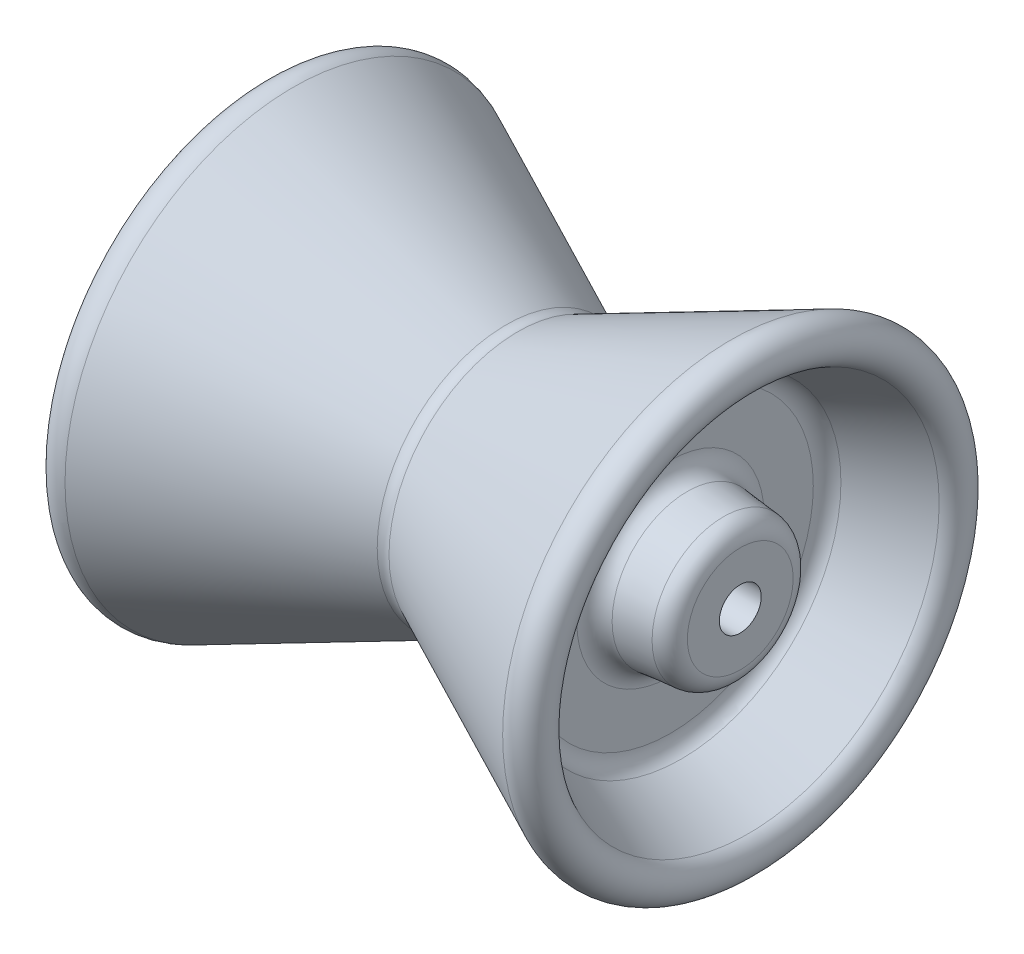
ISO-10303-21;
HEADER;
FILE_DESCRIPTION(('STEP AP214'),'2;1');
FILE_NAME('part.step','',(''),(''),'','','');
FILE_SCHEMA(('AUTOMOTIVE_DESIGN { 1 0 10303 214 1 1 1 1 }'));
ENDSEC;
DATA;
#1=APPLICATION_CONTEXT('core data for automotive mechanical design processes');
#2=APPLICATION_PROTOCOL_DEFINITION('international standard','automotive_design',2000,#1);
#3=PRODUCT_CONTEXT('',#1,'mechanical');
#4=PRODUCT('Part','Part','',(#3));
#5=PRODUCT_RELATED_PRODUCT_CATEGORY('part','',(#4));
#6=PRODUCT_DEFINITION_FORMATION('','',#4);
#7=PRODUCT_DEFINITION_CONTEXT('part definition',#1,'design');
#8=PRODUCT_DEFINITION('design','',#6,#7);
#9=PRODUCT_DEFINITION_SHAPE('','',#8);
#10=(LENGTH_UNIT() NAMED_UNIT(*) SI_UNIT(.MILLI.,.METRE.));
#11=(NAMED_UNIT(*) PLANE_ANGLE_UNIT() SI_UNIT($,.RADIAN.));
#12=(NAMED_UNIT(*) SI_UNIT($,.STERADIAN.) SOLID_ANGLE_UNIT());
#13=UNCERTAINTY_MEASURE_WITH_UNIT(LENGTH_MEASURE(1.E-05),#10,'distance_accuracy_value','');
#14=(GEOMETRIC_REPRESENTATION_CONTEXT(3) GLOBAL_UNCERTAINTY_ASSIGNED_CONTEXT((#13)) GLOBAL_UNIT_ASSIGNED_CONTEXT((#10,
#11,#12)) REPRESENTATION_CONTEXT('',''));
#15=CARTESIAN_POINT('',(0.,0.,0.));
#16=DIRECTION('',(0.,0.,1.));
#17=DIRECTION('',(1.,0.,0.));
#18=AXIS2_PLACEMENT_3D('',#15,#16,#17);
#19=CARTESIAN_POINT('',(253.421908313858,0.,-272.72374160698));
#20=DIRECTION('',(1.,0.,0.));
#21=DIRECTION('',(0.,0.,-1.));
#22=AXIS2_PLACEMENT_3D('',#19,#20,#21);
#23=CONICAL_SURFACE('',#22,204.98980954431,0.436332312998627);
#24=CARTESIAN_POINT('',(181.547634765186,0.,-272.72374160698));
#25=DIRECTION('',(-1.,0.,0.));
#26=DIRECTION('',(0.,0.,1.));
#27=AXIS2_PLACEMENT_3D('',#24,#25,#26);
#28=CIRCLE('',#27,171.474285364233);
#29=CARTESIAN_POINT('',(181.547634765186,0.,-101.249456242747));
#30=VERTEX_POINT('',#29);
#31=EDGE_CURVE('E123',#30,#30,#28,.T.);
#32=ORIENTED_EDGE('',*,*,#31,.T.);
#33=EDGE_LOOP('',(#32));
#34=FACE_BOUND('',#33,.T.);
#35=CARTESIAN_POINT('',(253.421908313858,0.,-272.72374160698));
#36=DIRECTION('',(-1.,0.,0.));
#37=DIRECTION('',(0.,0.,1.));
#38=AXIS2_PLACEMENT_3D('',#35,#36,#37);
#39=CIRCLE('',#38,204.98980954431);
#40=CARTESIAN_POINT('',(253.421908313858,0.,-67.7339320626702));
#41=VERTEX_POINT('',#40);
#42=EDGE_CURVE('E10',#41,#41,#39,.T.);
#43=ORIENTED_EDGE('',*,*,#42,.F.);
#44=EDGE_LOOP('',(#43));
#45=FACE_BOUND('',#44,.T.);
#46=ADVANCED_FACE('F35',(#34,#45),#23,.F.);
#47=CARTESIAN_POINT('',(244.124306555561,0.,-272.72374160698));
#48=DIRECTION('',(-1.,0.,0.));
#49=DIRECTION('',(0.,0.,1.));
#50=AXIS2_PLACEMENT_3D('',#47,#48,#49);
#51=TOROIDAL_SURFACE('',#50,224.928580859111,21.9999999999957);
#52=CARTESIAN_POINT('',(234.826704797267,0.,-272.72374160698));
#53=DIRECTION('',(-1.,0.,0.));
#54=DIRECTION('',(0.,0.,1.));
#55=AXIS2_PLACEMENT_3D('',#52,#53,#54);
#56=CIRCLE('',#55,244.867352173913);
#57=CARTESIAN_POINT('',(234.826704797267,0.,-27.8563894330671));
#58=VERTEX_POINT('',#57);
#59=EDGE_CURVE('E41',#58,#58,#56,.T.);
#60=ORIENTED_EDGE('',*,*,#59,.F.);
#61=EDGE_LOOP('',(#60));
#62=FACE_BOUND('',#61,.T.);
#63=ORIENTED_EDGE('',*,*,#42,.T.);
#64=EDGE_LOOP('',(#63));
#65=FACE_BOUND('',#64,.T.);
#66=ADVANCED_FACE('F337',(#62,#65),#51,.T.);
#67=CARTESIAN_POINT('',(234.826704797267,0.,-272.72374160698));
#68=DIRECTION('',(1.,0.,0.));
#69=DIRECTION('',(0.,0.,-1.));
#70=AXIS2_PLACEMENT_3D('',#67,#68,#69);
#71=CONICAL_SURFACE('',#70,244.867352173913,0.436332312998575);
#72=CARTESIAN_POINT('',(6.33927392611031,0.,-272.72374160698));
#73=DIRECTION('',(-1.,0.,0.));
#74=DIRECTION('',(0.,0.,1.));
#75=AXIS2_PLACEMENT_3D('',#72,#73,#74);
#76=CIRCLE('',#75,138.321913366534);
#77=CARTESIAN_POINT('',(6.33927392611031,0.,-134.401828240446));
#78=VERTEX_POINT('',#77);
#79=EDGE_CURVE('E45',#78,#78,#76,.T.);
#80=ORIENTED_EDGE('',*,*,#79,.F.);
#81=EDGE_LOOP('',(#80));
#82=FACE_BOUND('',#81,.T.);
#83=ORIENTED_EDGE('',*,*,#59,.T.);
#84=EDGE_LOOP('',(#83));
#85=FACE_BOUND('',#84,.T.);
#86=ADVANCED_FACE('F334',(#82,#85),#71,.T.);
#87=CARTESIAN_POINT('',(0.,0.,-272.72374160698));
#88=DIRECTION('',(-1.,0.,0.));
#89=DIRECTION('',(0.,0.,1.));
#90=AXIS2_PLACEMENT_3D('',#87,#88,#89);
#91=TOROIDAL_SURFACE('',#90,151.916530172083,14.9999999999996);
#92=ORIENTED_EDGE('',*,*,#79,.T.);
#93=EDGE_LOOP('',(#92));
#94=FACE_BOUND('',#93,.T.);
#95=CARTESIAN_POINT('',(-6.33927392611031,0.,-272.72374160698));
#96=DIRECTION('',(-1.,0.,0.));
#97=DIRECTION('',(0.,0.,1.));
#98=AXIS2_PLACEMENT_3D('',#95,#96,#97);
#99=CIRCLE('',#98,138.321913366534);
#100=CARTESIAN_POINT('',(-6.33927392611031,0.,-134.401828240446));
#101=VERTEX_POINT('',#100);
#102=EDGE_CURVE('E49',#101,#101,#99,.T.);
#103=ORIENTED_EDGE('',*,*,#102,.F.);
#104=EDGE_LOOP('',(#103));
#105=FACE_BOUND('',#104,.T.);
#106=ADVANCED_FACE('F330',(#94,#105),#91,.F.);
#107=CARTESIAN_POINT('',(-234.826704797267,0.,-272.72374160698));
#108=DIRECTION('',(-1.,0.,0.));
#109=DIRECTION('',(0.,0.,1.));
#110=AXIS2_PLACEMENT_3D('',#107,#108,#109);
#111=CONICAL_SURFACE('',#110,244.867352173916,0.436332312998585);
#112=ORIENTED_EDGE('',*,*,#102,.T.);
#113=EDGE_LOOP('',(#112));
#114=FACE_BOUND('',#113,.T.);
#115=CARTESIAN_POINT('',(-234.826704797267,0.,-272.72374160698));
#116=DIRECTION('',(-1.,0.,0.));
#117=DIRECTION('',(0.,0.,1.));
#118=AXIS2_PLACEMENT_3D('',#115,#116,#117);
#119=CIRCLE('',#118,244.867352173916);
#120=CARTESIAN_POINT('',(-234.826704797267,0.,-27.8563894330646));
#121=VERTEX_POINT('',#120);
#122=EDGE_CURVE('E54',#121,#121,#119,.T.);
#123=ORIENTED_EDGE('',*,*,#122,.F.);
#124=EDGE_LOOP('',(#123));
#125=FACE_BOUND('',#124,.T.);
#126=ADVANCED_FACE('F326',(#114,#125),#111,.T.);
#127=CARTESIAN_POINT('',(-244.124306555561,0.,-272.72374160698));
#128=DIRECTION('',(-1.,0.,0.));
#129=DIRECTION('',(0.,0.,1.));
#130=AXIS2_PLACEMENT_3D('',#127,#128,#129);
#131=TOROIDAL_SURFACE('',#130,224.928580859111,21.9999999999981);
#132=ORIENTED_EDGE('',*,*,#122,.T.);
#133=EDGE_LOOP('',(#132));
#134=FACE_BOUND('',#133,.T.);
#135=CARTESIAN_POINT('',(-253.421908313856,0.,-272.72374160698));
#136=DIRECTION('',(-1.,0.,0.));
#137=DIRECTION('',(0.,0.,1.));
#138=AXIS2_PLACEMENT_3D('',#135,#136,#137);
#139=CIRCLE('',#138,204.989809544305);
#140=CARTESIAN_POINT('',(-253.421908313856,0.,-67.7339320626748));
#141=VERTEX_POINT('',#140);
#142=EDGE_CURVE('E57',#141,#141,#139,.T.);
#143=ORIENTED_EDGE('',*,*,#142,.F.);
#144=EDGE_LOOP('',(#143));
#145=FACE_BOUND('',#144,.T.);
#146=ADVANCED_FACE('F322',(#134,#145),#131,.T.);
#147=CARTESIAN_POINT('',(-253.421908313856,0.,-272.72374160698));
#148=DIRECTION('',(-1.,0.,0.));
#149=DIRECTION('',(0.,0.,1.));
#150=AXIS2_PLACEMENT_3D('',#147,#148,#149);
#151=CONICAL_SURFACE('',#150,204.989809544305,0.436332312998582);
#152=CARTESIAN_POINT('',(-181.547634765186,0.,-272.72374160698));
#153=DIRECTION('',(-1.,0.,0.));
#154=DIRECTION('',(0.,0.,1.));
#155=AXIS2_PLACEMENT_3D('',#152,#153,#154);
#156=CIRCLE('',#155,171.474285364233);
#157=CARTESIAN_POINT('',(-181.547634765186,0.,-101.249456242747));
#158=VERTEX_POINT('',#157);
#159=EDGE_CURVE('E60',#158,#158,#156,.T.);
#160=ORIENTED_EDGE('',*,*,#159,.F.);
#161=EDGE_LOOP('',(#160));
#162=FACE_BOUND('',#161,.T.);
#163=ORIENTED_EDGE('',*,*,#142,.T.);
#164=EDGE_LOOP('',(#163));
#165=FACE_BOUND('',#164,.T.);
#166=ADVANCED_FACE('F318',(#162,#165),#151,.F.);
#167=CARTESIAN_POINT('',(-190.,0.,-272.72374160698));
#168=DIRECTION('',(-1.,0.,0.));
#169=DIRECTION('',(0.,0.,1.));
#170=AXIS2_PLACEMENT_3D('',#167,#168,#169);
#171=TOROIDAL_SURFACE('',#170,153.3481296235,20.);
#172=ORIENTED_EDGE('',*,*,#159,.T.);
#173=EDGE_LOOP('',(#172));
#174=FACE_BOUND('',#173,.T.);
#175=CARTESIAN_POINT('',(-170.,0.,-272.72374160698));
#176=DIRECTION('',(-1.,0.,0.));
#177=DIRECTION('',(0.,0.,1.));
#178=AXIS2_PLACEMENT_3D('',#175,#176,#177);
#179=CIRCLE('',#178,153.3481296235);
#180=CARTESIAN_POINT('',(-170.,0.,-119.37561198348));
#181=VERTEX_POINT('',#180);
#182=EDGE_CURVE('E63',#181,#181,#179,.T.);
#183=ORIENTED_EDGE('',*,*,#182,.F.);
#184=EDGE_LOOP('',(#183));
#185=FACE_BOUND('',#184,.T.);
#186=ADVANCED_FACE('F314',(#174,#185),#171,.F.);
#187=CARTESIAN_POINT('',(-170.,0.,0.));
#188=DIRECTION('',(1.,0.,0.));
#189=DIRECTION('',(0.,0.,-1.));
#190=AXIS2_PLACEMENT_3D('',#187,#188,#189);
#191=PLANE('',#190);
#192=CARTESIAN_POINT('',(-170.,0.,-272.72374160698));
#193=DIRECTION('',(-1.,0.,0.));
#194=DIRECTION('',(0.,0.,1.));
#195=AXIS2_PLACEMENT_3D('',#192,#193,#194);
#196=CIRCLE('',#195,100.453690595235);
#197=CARTESIAN_POINT('',(-170.,0.,-172.270051011745));
#198=VERTEX_POINT('',#197);
#199=EDGE_CURVE('E66',#198,#198,#196,.T.);
#200=ORIENTED_EDGE('',*,*,#199,.F.);
#201=EDGE_LOOP('',(#200));
#202=FACE_BOUND('',#201,.T.);
#203=ORIENTED_EDGE('',*,*,#182,.T.);
#204=EDGE_LOOP('',(#203));
#205=FACE_BOUND('',#204,.T.);
#206=ADVANCED_FACE('F310',(#202,#205),#191,.F.);
#207=CARTESIAN_POINT('',(-190.,0.,-272.72374160698));
#208=DIRECTION('',(-1.,0.,0.));
#209=DIRECTION('',(0.,0.,1.));
#210=AXIS2_PLACEMENT_3D('',#207,#208,#209);
#211=TOROIDAL_SURFACE('',#210,100.453690595235,20.);
#212=ORIENTED_EDGE('',*,*,#199,.T.);
#213=EDGE_LOOP('',(#212));
#214=FACE_BOUND('',#213,.T.);
#215=CARTESIAN_POINT('',(-188.00992561958,0.,-272.72374160698));
#216=DIRECTION('',(-1.,0.,0.));
#217=DIRECTION('',(0.,0.,1.));
#218=AXIS2_PLACEMENT_3D('',#215,#216,#217);
#219=CIRCLE('',#218,80.5529467910352);
#220=CARTESIAN_POINT('',(-188.00992561958,0.,-192.170794815945));
#221=VERTEX_POINT('',#220);
#222=EDGE_CURVE('E69',#221,#221,#219,.T.);
#223=ORIENTED_EDGE('',*,*,#222,.F.);
#224=EDGE_LOOP('',(#223));
#225=FACE_BOUND('',#224,.T.);
#226=ADVANCED_FACE('F306',(#214,#225),#211,.F.);
#227=CARTESIAN_POINT('',(-226.99007438042,0.,-272.72374160698));
#228=DIRECTION('',(1.,0.,0.));
#229=DIRECTION('',(0.,0.,-1.));
#230=AXIS2_PLACEMENT_3D('',#227,#228,#229);
#231=CONICAL_SURFACE('',#230,76.6549319149512,0.0996686524911619);
#232=ORIENTED_EDGE('',*,*,#222,.T.);
#233=EDGE_LOOP('',(#232));
#234=FACE_BOUND('',#233,.T.);
#235=CARTESIAN_POINT('',(-226.99007438042,0.,-272.72374160698));
#236=DIRECTION('',(-1.,0.,0.));
#237=DIRECTION('',(0.,0.,1.));
#238=AXIS2_PLACEMENT_3D('',#235,#236,#237);
#239=CIRCLE('',#238,76.6549319149512);
#240=CARTESIAN_POINT('',(-226.99007438042,0.,-196.068809692029));
#241=VERTEX_POINT('',#240);
#242=EDGE_CURVE('E72',#241,#241,#239,.T.);
#243=ORIENTED_EDGE('',*,*,#242,.F.);
#244=EDGE_LOOP('',(#243));
#245=FACE_BOUND('',#244,.T.);
#246=ADVANCED_FACE('F302',(#234,#245),#231,.T.);
#247=CARTESIAN_POINT('',(-225.,0.,-272.72374160698));
#248=DIRECTION('',(-1.,0.,0.));
#249=DIRECTION('',(0.,0.,1.));
#250=AXIS2_PLACEMENT_3D('',#247,#248,#249);
#251=TOROIDAL_SURFACE('',#250,56.7541881107514,20.);
#252=CARTESIAN_POINT('',(-245.,0.,-272.72374160698));
#253=DIRECTION('',(-1.,0.,0.));
#254=DIRECTION('',(0.,0.,1.));
#255=AXIS2_PLACEMENT_3D('',#252,#253,#254);
#256=CIRCLE('',#255,56.7541881107514);
#257=CARTESIAN_POINT('',(-245.,0.,-215.969553496229));
#258=VERTEX_POINT('',#257);
#259=EDGE_CURVE('E75',#258,#258,#256,.T.);
#260=ORIENTED_EDGE('',*,*,#259,.F.);
#261=EDGE_LOOP('',(#260));
#262=FACE_BOUND('',#261,.T.);
#263=ORIENTED_EDGE('',*,*,#242,.T.);
#264=EDGE_LOOP('',(#263));
#265=FACE_BOUND('',#264,.T.);
#266=ADVANCED_FACE('F298',(#262,#265),#251,.T.);
#267=CARTESIAN_POINT('',(-245.,0.,0.));
#268=DIRECTION('',(1.,0.,0.));
#269=DIRECTION('',(0.,0.,-1.));
#270=AXIS2_PLACEMENT_3D('',#267,#268,#269);
#271=PLANE('',#270);
#272=CARTESIAN_POINT('',(-245.,0.,-272.72374160698));
#273=DIRECTION('',(-1.,0.,0.));
#274=DIRECTION('',(0.,0.,1.));
#275=AXIS2_PLACEMENT_3D('',#272,#273,#274);
#276=CIRCLE('',#275,22.5);
#277=CARTESIAN_POINT('',(-245.,0.,-250.22374160698));
#278=VERTEX_POINT('',#277);
#279=EDGE_CURVE('E78',#278,#278,#276,.T.);
#280=ORIENTED_EDGE('',*,*,#279,.F.);
#281=EDGE_LOOP('',(#280));
#282=FACE_BOUND('',#281,.T.);
#283=ORIENTED_EDGE('',*,*,#259,.T.);
#284=EDGE_LOOP('',(#283));
#285=FACE_BOUND('',#284,.T.);
#286=ADVANCED_FACE('F294',(#282,#285),#271,.F.);
#287=CARTESIAN_POINT('',(-110.405359192609,0.,-272.72374160698));
#288=DIRECTION('',(-1.,0.,0.));
#289=DIRECTION('',(0.,0.,1.));
#290=AXIS2_PLACEMENT_3D('',#287,#288,#289);
#291=CYLINDRICAL_SURFACE('',#290,22.5);
#292=CARTESIAN_POINT('',(-120.,0.,-272.72374160698));
#293=DIRECTION('',(-1.,0.,0.));
#294=DIRECTION('',(0.,0.,1.));
#295=AXIS2_PLACEMENT_3D('',#292,#293,#294);
#296=CIRCLE('',#295,22.5);
#297=CARTESIAN_POINT('',(-120.,0.,-250.22374160698));
#298=VERTEX_POINT('',#297);
#299=EDGE_CURVE('E81',#298,#298,#296,.T.);
#300=ORIENTED_EDGE('',*,*,#299,.F.);
#301=EDGE_LOOP('',(#300));
#302=FACE_BOUND('',#301,.T.);
#303=ORIENTED_EDGE('',*,*,#279,.T.);
#304=EDGE_LOOP('',(#303));
#305=FACE_BOUND('',#304,.T.);
#306=ADVANCED_FACE('F290',(#302,#305),#291,.F.);
#307=CARTESIAN_POINT('',(-120.,0.,0.));
#308=DIRECTION('',(1.,0.,0.));
#309=DIRECTION('',(0.,0.,-1.));
#310=AXIS2_PLACEMENT_3D('',#307,#308,#309);
#311=PLANE('',#310);
#312=ORIENTED_EDGE('',*,*,#299,.T.);
#313=EDGE_LOOP('',(#312));
#314=FACE_BOUND('',#313,.T.);
#315=CARTESIAN_POINT('',(-120.,0.,-272.72374160698));
#316=DIRECTION('',(-1.,0.,0.));
#317=DIRECTION('',(0.,0.,1.));
#318=AXIS2_PLACEMENT_3D('',#315,#316,#317);
#319=CIRCLE('',#318,111.380440389551);
#320=CARTESIAN_POINT('',(-120.,0.,-161.34330121743));
#321=VERTEX_POINT('',#320);
#322=EDGE_CURVE('E84',#321,#321,#319,.T.);
#323=ORIENTED_EDGE('',*,*,#322,.F.);
#324=EDGE_LOOP('',(#323));
#325=FACE_BOUND('',#324,.T.);
#326=ADVANCED_FACE('F286',(#314,#325),#311,.T.);
#327=CARTESIAN_POINT('',(-100.,0.,-272.72374160698));
#328=DIRECTION('',(-1.,0.,0.));
#329=DIRECTION('',(0.,0.,1.));
#330=AXIS2_PLACEMENT_3D('',#327,#328,#329);
#331=TOROIDAL_SURFACE('',#330,111.380440389551,20.);
#332=ORIENTED_EDGE('',*,*,#322,.T.);
#333=EDGE_LOOP('',(#332));
#334=FACE_BOUND('',#333,.T.);
#335=CARTESIAN_POINT('',(-91.5476347651862,0.,-272.72374160698));
#336=DIRECTION('',(-1.,0.,0.));
#337=DIRECTION('',(0.,0.,1.));
#338=AXIS2_PLACEMENT_3D('',#335,#336,#337);
#339=CIRCLE('',#338,129.506596130284);
#340=CARTESIAN_POINT('',(-91.5476347651862,0.,-143.217145476697));
#341=VERTEX_POINT('',#340);
#342=EDGE_CURVE('E87',#341,#341,#339,.T.);
#343=ORIENTED_EDGE('',*,*,#342,.F.);
#344=EDGE_LOOP('',(#343));
#345=FACE_BOUND('',#344,.T.);
#346=ADVANCED_FACE('F282',(#334,#345),#331,.F.);
#347=CARTESIAN_POINT('',(-91.5476347651862,0.,-272.72374160698));
#348=DIRECTION('',(-1.,0.,0.));
#349=DIRECTION('',(0.,0.,1.));
#350=AXIS2_PLACEMENT_3D('',#347,#348,#349);
#351=CONICAL_SURFACE('',#350,129.506596130284,0.43633231299858);
#352=CARTESIAN_POINT('',(-25.3570957044434,0.,-272.72374160698));
#353=DIRECTION('',(-1.,0.,0.));
#354=DIRECTION('',(0.,0.,1.));
#355=AXIS2_PLACEMENT_3D('',#352,#353,#354);
#356=CIRCLE('',#355,98.6414408688519);
#357=CARTESIAN_POINT('',(-25.3570957044434,0.,-174.082300738128));
#358=VERTEX_POINT('',#357);
#359=EDGE_CURVE('E90',#358,#358,#356,.T.);
#360=ORIENTED_EDGE('',*,*,#359,.F.);
#361=EDGE_LOOP('',(#360));
#362=FACE_BOUND('',#361,.T.);
#363=ORIENTED_EDGE('',*,*,#342,.T.);
#364=EDGE_LOOP('',(#363));
#365=FACE_BOUND('',#364,.T.);
#366=ADVANCED_FACE('F278',(#362,#365),#351,.F.);
#367=CARTESIAN_POINT('',(0.,0.,-272.72374160698));
#368=DIRECTION('',(-1.,0.,0.));
#369=DIRECTION('',(0.,0.,1.));
#370=AXIS2_PLACEMENT_3D('',#367,#368,#369);
#371=TOROIDAL_SURFACE('',#370,153.019908091054,60.0000000000035);
#372=CARTESIAN_POINT('',(25.3570957044434,0.,-272.72374160698));
#373=DIRECTION('',(-1.,0.,0.));
#374=DIRECTION('',(0.,0.,1.));
#375=AXIS2_PLACEMENT_3D('',#372,#373,#374);
#376=CIRCLE('',#375,98.6414408688519);
#377=CARTESIAN_POINT('',(25.3570957044434,0.,-174.082300738128));
#378=VERTEX_POINT('',#377);
#379=EDGE_CURVE('E93',#378,#378,#376,.T.);
#380=ORIENTED_EDGE('',*,*,#379,.F.);
#381=EDGE_LOOP('',(#380));
#382=FACE_BOUND('',#381,.T.);
#383=ORIENTED_EDGE('',*,*,#359,.T.);
#384=EDGE_LOOP('',(#383));
#385=FACE_BOUND('',#384,.T.);
#386=ADVANCED_FACE('F274',(#382,#385),#371,.T.);
#387=CARTESIAN_POINT('',(91.5476347651861,0.,-272.72374160698));
#388=DIRECTION('',(1.,0.,0.));
#389=DIRECTION('',(0.,0.,-1.));
#390=AXIS2_PLACEMENT_3D('',#387,#388,#389);
#391=CONICAL_SURFACE('',#390,129.506596130284,0.43633231299858);
#392=ORIENTED_EDGE('',*,*,#379,.T.);
#393=EDGE_LOOP('',(#392));
#394=FACE_BOUND('',#393,.T.);
#395=CARTESIAN_POINT('',(91.5476347651861,0.,-272.72374160698));
#396=DIRECTION('',(-1.,0.,0.));
#397=DIRECTION('',(0.,0.,1.));
#398=AXIS2_PLACEMENT_3D('',#395,#396,#397);
#399=CIRCLE('',#398,129.506596130284);
#400=CARTESIAN_POINT('',(91.5476347651861,0.,-143.217145476697));
#401=VERTEX_POINT('',#400);
#402=EDGE_CURVE('E96',#401,#401,#399,.T.);
#403=ORIENTED_EDGE('',*,*,#402,.F.);
#404=EDGE_LOOP('',(#403));
#405=FACE_BOUND('',#404,.T.);
#406=ADVANCED_FACE('F270',(#394,#405),#391,.F.);
#407=CARTESIAN_POINT('',(100.,0.,-272.72374160698));
#408=DIRECTION('',(-1.,0.,0.));
#409=DIRECTION('',(0.,0.,1.));
#410=AXIS2_PLACEMENT_3D('',#407,#408,#409);
#411=TOROIDAL_SURFACE('',#410,111.380440389551,20.);
#412=CARTESIAN_POINT('',(120.,0.,-272.72374160698));
#413=DIRECTION('',(-1.,0.,0.));
#414=DIRECTION('',(0.,0.,1.));
#415=AXIS2_PLACEMENT_3D('',#412,#413,#414);
#416=CIRCLE('',#415,111.380440389551);
#417=CARTESIAN_POINT('',(120.,0.,-161.34330121743));
#418=VERTEX_POINT('',#417);
#419=EDGE_CURVE('E99',#418,#418,#416,.T.);
#420=ORIENTED_EDGE('',*,*,#419,.F.);
#421=EDGE_LOOP('',(#420));
#422=FACE_BOUND('',#421,.T.);
#423=ORIENTED_EDGE('',*,*,#402,.T.);
#424=EDGE_LOOP('',(#423));
#425=FACE_BOUND('',#424,.T.);
#426=ADVANCED_FACE('F266',(#422,#425),#411,.F.);
#427=CARTESIAN_POINT('',(120.,0.,0.));
#428=DIRECTION('',(1.,0.,0.));
#429=DIRECTION('',(0.,0.,-1.));
#430=AXIS2_PLACEMENT_3D('',#427,#428,#429);
#431=PLANE('',#430);
#432=CARTESIAN_POINT('',(120.,0.,-272.72374160698));
#433=DIRECTION('',(-1.,0.,0.));
#434=DIRECTION('',(0.,0.,1.));
#435=AXIS2_PLACEMENT_3D('',#432,#433,#434);
#436=CIRCLE('',#435,22.5);
#437=CARTESIAN_POINT('',(120.,0.,-250.22374160698));
#438=VERTEX_POINT('',#437);
#439=EDGE_CURVE('E102',#438,#438,#436,.T.);
#440=ORIENTED_EDGE('',*,*,#439,.F.);
#441=EDGE_LOOP('',(#440));
#442=FACE_BOUND('',#441,.T.);
#443=ORIENTED_EDGE('',*,*,#419,.T.);
#444=EDGE_LOOP('',(#443));
#445=FACE_BOUND('',#444,.T.);
#446=ADVANCED_FACE('F262',(#442,#445),#431,.F.);
#447=CARTESIAN_POINT('',(-110.405359192609,0.,-272.72374160698));
#448=DIRECTION('',(-1.,0.,0.));
#449=DIRECTION('',(0.,0.,1.));
#450=AXIS2_PLACEMENT_3D('',#447,#448,#449);
#451=CYLINDRICAL_SURFACE('',#450,22.5);
#452=ORIENTED_EDGE('',*,*,#439,.T.);
#453=EDGE_LOOP('',(#452));
#454=FACE_BOUND('',#453,.T.);
#455=CARTESIAN_POINT('',(244.999999999999,0.,-272.72374160698));
#456=DIRECTION('',(-1.,0.,0.));
#457=DIRECTION('',(0.,0.,1.));
#458=AXIS2_PLACEMENT_3D('',#455,#456,#457);
#459=CIRCLE('',#458,22.5);
#460=CARTESIAN_POINT('',(244.999999999999,0.,-250.22374160698));
#461=VERTEX_POINT('',#460);
#462=EDGE_CURVE('E105',#461,#461,#459,.T.);
#463=ORIENTED_EDGE('',*,*,#462,.F.);
#464=EDGE_LOOP('',(#463));
#465=FACE_BOUND('',#464,.T.);
#466=ADVANCED_FACE('F258',(#454,#465),#451,.F.);
#467=CARTESIAN_POINT('',(244.999999999999,0.,-7.18901943859285E-12));
#468=DIRECTION('',(1.,0.,0.));
#469=DIRECTION('',(0.,0.,-1.));
#470=AXIS2_PLACEMENT_3D('',#467,#468,#469);
#471=PLANE('',#470);
#472=ORIENTED_EDGE('',*,*,#462,.T.);
#473=EDGE_LOOP('',(#472));
#474=FACE_BOUND('',#473,.T.);
#475=CARTESIAN_POINT('',(244.999999999998,0.,-272.72374160698));
#476=DIRECTION('',(-1.,0.,0.));
#477=DIRECTION('',(0.,0.,1.));
#478=AXIS2_PLACEMENT_3D('',#475,#476,#477);
#479=CIRCLE('',#478,56.7541881107531);
#480=CARTESIAN_POINT('',(244.999999999998,0.,-215.969553496227));
#481=VERTEX_POINT('',#480);
#482=EDGE_CURVE('E108',#481,#481,#479,.T.);
#483=ORIENTED_EDGE('',*,*,#482,.F.);
#484=EDGE_LOOP('',(#483));
#485=FACE_BOUND('',#484,.T.);
#486=ADVANCED_FACE('F254',(#474,#485),#471,.T.);
#487=CARTESIAN_POINT('',(224.999999999998,0.,-272.72374160698));
#488=DIRECTION('',(-1.,0.,0.));
#489=DIRECTION('',(0.,0.,1.));
#490=AXIS2_PLACEMENT_3D('',#487,#488,#489);
#491=TOROIDAL_SURFACE('',#490,56.7541881107529,20.);
#492=ORIENTED_EDGE('',*,*,#482,.T.);
#493=EDGE_LOOP('',(#492));
#494=FACE_BOUND('',#493,.T.);
#495=CARTESIAN_POINT('',(226.990074380418,0.,-272.72374160698));
#496=DIRECTION('',(-1.,0.,0.));
#497=DIRECTION('',(0.,0.,1.));
#498=AXIS2_PLACEMENT_3D('',#495,#496,#497);
#499=CIRCLE('',#498,76.6549319149528);
#500=CARTESIAN_POINT('',(226.990074380418,0.,-196.068809692027));
#501=VERTEX_POINT('',#500);
#502=EDGE_CURVE('E111',#501,#501,#499,.T.);
#503=ORIENTED_EDGE('',*,*,#502,.F.);
#504=EDGE_LOOP('',(#503));
#505=FACE_BOUND('',#504,.T.);
#506=ADVANCED_FACE('F250',(#494,#505),#491,.T.);
#507=CARTESIAN_POINT('',(226.990074380418,0.,-272.72374160698));
#508=DIRECTION('',(-1.,0.,0.));
#509=DIRECTION('',(0.,0.,1.));
#510=AXIS2_PLACEMENT_3D('',#507,#508,#509);
#511=CONICAL_SURFACE('',#510,76.6549319149528,0.0996686524911561);
#512=CARTESIAN_POINT('',(188.009925619578,0.,-272.72374160698));
#513=DIRECTION('',(-1.,0.,0.));
#514=DIRECTION('',(0.,0.,1.));
#515=AXIS2_PLACEMENT_3D('',#512,#513,#514);
#516=CIRCLE('',#515,80.5529467910365);
#517=CARTESIAN_POINT('',(188.009925619578,0.,-192.170794815944));
#518=VERTEX_POINT('',#517);
#519=EDGE_CURVE('E114',#518,#518,#516,.T.);
#520=ORIENTED_EDGE('',*,*,#519,.F.);
#521=EDGE_LOOP('',(#520));
#522=FACE_BOUND('',#521,.T.);
#523=ORIENTED_EDGE('',*,*,#502,.T.);
#524=EDGE_LOOP('',(#523));
#525=FACE_BOUND('',#524,.T.);
#526=ADVANCED_FACE('F246',(#522,#525),#511,.T.);
#527=CARTESIAN_POINT('',(189.999999999998,0.,-272.72374160698));
#528=DIRECTION('',(-1.,0.,0.));
#529=DIRECTION('',(0.,0.,1.));
#530=AXIS2_PLACEMENT_3D('',#527,#528,#529);
#531=TOROIDAL_SURFACE('',#530,100.453690595236,20.);
#532=CARTESIAN_POINT('',(169.999999999998,0.,-272.72374160698));
#533=DIRECTION('',(-1.,0.,0.));
#534=DIRECTION('',(0.,0.,1.));
#535=AXIS2_PLACEMENT_3D('',#532,#533,#534);
#536=CIRCLE('',#535,100.453690595236);
#537=CARTESIAN_POINT('',(169.999999999998,0.,-172.270051011744));
#538=VERTEX_POINT('',#537);
#539=EDGE_CURVE('E117',#538,#538,#536,.T.);
#540=ORIENTED_EDGE('',*,*,#539,.F.);
#541=EDGE_LOOP('',(#540));
#542=FACE_BOUND('',#541,.T.);
#543=ORIENTED_EDGE('',*,*,#519,.T.);
#544=EDGE_LOOP('',(#543));
#545=FACE_BOUND('',#544,.T.);
#546=ADVANCED_FACE('F242',(#542,#545),#531,.F.);
#547=CARTESIAN_POINT('',(169.999999999999,0.,6.3335542229987E-12));
#548=DIRECTION('',(1.,0.,0.));
#549=DIRECTION('',(0.,0.,-1.));
#550=AXIS2_PLACEMENT_3D('',#547,#548,#549);
#551=PLANE('',#550);
#552=ORIENTED_EDGE('',*,*,#539,.T.);
#553=EDGE_LOOP('',(#552));
#554=FACE_BOUND('',#553,.T.);
#555=CARTESIAN_POINT('',(170.,0.,-272.72374160698));
#556=DIRECTION('',(-1.,0.,0.));
#557=DIRECTION('',(0.,0.,1.));
#558=AXIS2_PLACEMENT_3D('',#555,#556,#557);
#559=CIRCLE('',#558,153.3481296235);
#560=CARTESIAN_POINT('',(170.,0.,-119.37561198348));
#561=VERTEX_POINT('',#560);
#562=EDGE_CURVE('E120',#561,#561,#559,.T.);
#563=ORIENTED_EDGE('',*,*,#562,.F.);
#564=EDGE_LOOP('',(#563));
#565=FACE_BOUND('',#564,.T.);
#566=ADVANCED_FACE('F238',(#554,#565),#551,.T.);
#567=CARTESIAN_POINT('',(190.,0.,-272.72374160698));
#568=DIRECTION('',(-1.,0.,0.));
#569=DIRECTION('',(0.,0.,1.));
#570=AXIS2_PLACEMENT_3D('',#567,#568,#569);
#571=TOROIDAL_SURFACE('',#570,153.3481296235,20.);
#572=ORIENTED_EDGE('',*,*,#31,.F.);
#573=EDGE_LOOP('',(#572));
#574=FACE_BOUND('',#573,.T.);
#575=ORIENTED_EDGE('',*,*,#562,.T.);
#576=EDGE_LOOP('',(#575));
#577=FACE_BOUND('',#576,.T.);
#578=ADVANCED_FACE('F235',(#574,#577),#571,.F.);
#579=CLOSED_SHELL('',(#46,#66,#86,#106,#126,#146,#166,#186,#206,#226,#246,#266,#286,#306,#326,
#346,#366,#386,#406,#426,#446,#466,#486,#506,#526,#546,#566,#578));
#580=CARTESIAN_POINT('',(249.19572569645,0.,-272.72374160698));
#581=DIRECTION('',(1.,0.,0.));
#582=DIRECTION('',(0.,0.,-1.));
#583=AXIS2_PLACEMENT_3D('',#580,#581,#582);
#584=CONICAL_SURFACE('',#583,214.052887414676,0.436332312998626);
#585=CARTESIAN_POINT('',(177.321452147779,0.,-272.72374160698));
#586=DIRECTION('',(-1.,0.,0.));
#587=DIRECTION('',(0.,0.,1.));
#588=AXIS2_PLACEMENT_3D('',#585,#586,#587);
#589=CIRCLE('',#588,180.5373632346);
#590=CARTESIAN_POINT('',(177.321452147779,0.,-92.1863783723804));
#591=VERTEX_POINT('',#590);
#592=EDGE_CURVE('E207',#591,#591,#589,.T.);
#593=ORIENTED_EDGE('',*,*,#592,.F.);
#594=EDGE_LOOP('',(#593));
#595=FACE_BOUND('',#594,.T.);
#596=CARTESIAN_POINT('',(249.19572569645,0.,-272.72374160698));
#597=DIRECTION('',(-1.,0.,0.));
#598=DIRECTION('',(0.,0.,1.));
#599=AXIS2_PLACEMENT_3D('',#596,#597,#598);
#600=CIRCLE('',#599,214.052887414676);
#601=CARTESIAN_POINT('',(249.19572569645,0.,-58.6708541923043));
#602=VERTEX_POINT('',#601);
#603=EDGE_CURVE('E126',#602,#602,#600,.T.);
#604=ORIENTED_EDGE('',*,*,#603,.T.);
#605=EDGE_LOOP('',(#604));
#606=FACE_BOUND('',#605,.T.);
#607=ADVANCED_FACE('F214',(#595,#606),#584,.T.);
#608=CARTESIAN_POINT('',(244.124306555561,0.,-272.72374160698));
#609=DIRECTION('',(-1.,0.,0.));
#610=DIRECTION('',(0.,0.,1.));
#611=AXIS2_PLACEMENT_3D('',#608,#609,#610);
#612=TOROIDAL_SURFACE('',#611,224.928580859111,11.9999999999957);
#613=CARTESIAN_POINT('',(239.052887414674,0.,-272.72374160698));
#614=DIRECTION('',(-1.,0.,0.));
#615=DIRECTION('',(0.,0.,1.));
#616=AXIS2_PLACEMENT_3D('',#613,#614,#615);
#617=CIRCLE('',#616,235.804274303547);
#618=CARTESIAN_POINT('',(239.052887414674,0.,-36.9194673034334));
#619=VERTEX_POINT('',#618);
#620=EDGE_CURVE('E129',#619,#619,#617,.T.);
#621=ORIENTED_EDGE('',*,*,#620,.T.);
#622=EDGE_LOOP('',(#621));
#623=FACE_BOUND('',#622,.T.);
#624=ORIENTED_EDGE('',*,*,#603,.F.);
#625=EDGE_LOOP('',(#624));
#626=FACE_BOUND('',#625,.T.);
#627=ADVANCED_FACE('F217',(#623,#626),#612,.F.);
#628=CARTESIAN_POINT('',(239.052887414674,0.,-272.72374160698));
#629=DIRECTION('',(1.,0.,0.));
#630=DIRECTION('',(0.,0.,-1.));
#631=AXIS2_PLACEMENT_3D('',#628,#629,#630);
#632=CONICAL_SURFACE('',#631,235.804274303547,0.436332312998575);
#633=CARTESIAN_POINT('',(10.5654565435173,0.,-272.72374160698));
#634=DIRECTION('',(-1.,0.,0.));
#635=DIRECTION('',(0.,0.,1.));
#636=AXIS2_PLACEMENT_3D('',#633,#634,#635);
#637=CIRCLE('',#636,129.258835496167);
#638=CARTESIAN_POINT('',(10.5654565435173,0.,-143.464906110813));
#639=VERTEX_POINT('',#638);
#640=EDGE_CURVE('E132',#639,#639,#637,.T.);
#641=ORIENTED_EDGE('',*,*,#640,.T.);
#642=EDGE_LOOP('',(#641));
#643=FACE_BOUND('',#642,.T.);
#644=ORIENTED_EDGE('',*,*,#620,.F.);
#645=EDGE_LOOP('',(#644));
#646=FACE_BOUND('',#645,.T.);
#647=ADVANCED_FACE('F223',(#643,#646),#632,.F.);
#648=CARTESIAN_POINT('',(0.,0.,-272.72374160698));
#649=DIRECTION('',(-1.,0.,0.));
#650=DIRECTION('',(0.,0.,1.));
#651=AXIS2_PLACEMENT_3D('',#648,#649,#650);
#652=TOROIDAL_SURFACE('',#651,151.916530172083,24.9999999999996);
#653=ORIENTED_EDGE('',*,*,#640,.F.);
#654=EDGE_LOOP('',(#653));
#655=FACE_BOUND('',#654,.T.);
#656=CARTESIAN_POINT('',(-10.5654565435173,0.,-272.72374160698));
#657=DIRECTION('',(-1.,0.,0.));
#658=DIRECTION('',(0.,0.,1.));
#659=AXIS2_PLACEMENT_3D('',#656,#657,#658);
#660=CIRCLE('',#659,129.258835496167);
#661=CARTESIAN_POINT('',(-10.5654565435173,0.,-143.464906110813));
#662=VERTEX_POINT('',#661);
#663=EDGE_CURVE('E135',#662,#662,#660,.T.);
#664=ORIENTED_EDGE('',*,*,#663,.T.);
#665=EDGE_LOOP('',(#664));
#666=FACE_BOUND('',#665,.T.);
#667=ADVANCED_FACE('F229',(#655,#666),#652,.T.);
#668=CARTESIAN_POINT('',(-239.052887414674,0.,-272.72374160698));
#669=DIRECTION('',(-1.,0.,0.));
#670=DIRECTION('',(0.,0.,1.));
#671=AXIS2_PLACEMENT_3D('',#668,#669,#670);
#672=CONICAL_SURFACE('',#671,235.804274303548,0.43633231299858);
#673=ORIENTED_EDGE('',*,*,#663,.F.);
#674=EDGE_LOOP('',(#673));
#675=FACE_BOUND('',#674,.T.);
#676=CARTESIAN_POINT('',(-239.052887414674,0.,-272.72374160698));
#677=DIRECTION('',(-1.,0.,0.));
#678=DIRECTION('',(0.,0.,1.));
#679=AXIS2_PLACEMENT_3D('',#676,#677,#678);
#680=CIRCLE('',#679,235.804274303548);
#681=CARTESIAN_POINT('',(-239.052887414674,0.,-36.9194673034321));
#682=VERTEX_POINT('',#681);
#683=EDGE_CURVE('E138',#682,#682,#680,.T.);
#684=ORIENTED_EDGE('',*,*,#683,.T.);
#685=EDGE_LOOP('',(#684));
#686=FACE_BOUND('',#685,.T.);
#687=ADVANCED_FACE('F568',(#675,#686),#672,.F.);
#688=CARTESIAN_POINT('',(-244.124306555561,0.,-272.72374160698));
#689=DIRECTION('',(-1.,0.,0.));
#690=DIRECTION('',(0.,0.,1.));
#691=AXIS2_PLACEMENT_3D('',#688,#689,#690);
#692=TOROIDAL_SURFACE('',#691,224.928580859111,11.9999999999981);
#693=ORIENTED_EDGE('',*,*,#683,.F.);
#694=EDGE_LOOP('',(#693));
#695=FACE_BOUND('',#694,.T.);
#696=CARTESIAN_POINT('',(-249.19572569645,0.,-272.72374160698));
#697=DIRECTION('',(-1.,0.,0.));
#698=DIRECTION('',(0.,0.,1.));
#699=AXIS2_PLACEMENT_3D('',#696,#697,#698);
#700=CIRCLE('',#699,214.052887414672);
#701=CARTESIAN_POINT('',(-249.19572569645,0.,-58.6708541923082));
#702=VERTEX_POINT('',#701);
#703=EDGE_CURVE('E141',#702,#702,#700,.T.);
#704=ORIENTED_EDGE('',*,*,#703,.T.);
#705=EDGE_LOOP('',(#704));
#706=FACE_BOUND('',#705,.T.);
#707=ADVANCED_FACE('F578',(#695,#706),#692,.F.);
#708=CARTESIAN_POINT('',(-249.19572569645,0.,-272.72374160698));
#709=DIRECTION('',(-1.,0.,0.));
#710=DIRECTION('',(0.,0.,1.));
#711=AXIS2_PLACEMENT_3D('',#708,#709,#710);
#712=CONICAL_SURFACE('',#711,214.052887414672,0.436332312998581);
#713=CARTESIAN_POINT('',(-177.321452147779,0.,-272.72374160698));
#714=DIRECTION('',(-1.,0.,0.));
#715=DIRECTION('',(0.,0.,1.));
#716=AXIS2_PLACEMENT_3D('',#713,#714,#715);
#717=CIRCLE('',#716,180.5373632346);
#718=CARTESIAN_POINT('',(-177.321452147779,0.,-92.1863783723804));
#719=VERTEX_POINT('',#718);
#720=EDGE_CURVE('E144',#719,#719,#717,.T.);
#721=ORIENTED_EDGE('',*,*,#720,.T.);
#722=EDGE_LOOP('',(#721));
#723=FACE_BOUND('',#722,.T.);
#724=ORIENTED_EDGE('',*,*,#703,.F.);
#725=EDGE_LOOP('',(#724));
#726=FACE_BOUND('',#725,.T.);
#727=ADVANCED_FACE('F589',(#723,#726),#712,.T.);
#728=CARTESIAN_POINT('',(-190.,0.,-272.72374160698));
#729=DIRECTION('',(-1.,0.,0.));
#730=DIRECTION('',(0.,0.,1.));
#731=AXIS2_PLACEMENT_3D('',#728,#729,#730);
#732=TOROIDAL_SURFACE('',#731,153.3481296235,30.);
#733=ORIENTED_EDGE('',*,*,#720,.F.);
#734=EDGE_LOOP('',(#733));
#735=FACE_BOUND('',#734,.T.);
#736=CARTESIAN_POINT('',(-160.,0.,-272.72374160698));
#737=DIRECTION('',(-1.,0.,0.));
#738=DIRECTION('',(0.,0.,1.));
#739=AXIS2_PLACEMENT_3D('',#736,#737,#738);
#740=CIRCLE('',#739,153.3481296235);
#741=CARTESIAN_POINT('',(-160.,0.,-119.37561198348));
#742=VERTEX_POINT('',#741);
#743=EDGE_CURVE('E147',#742,#742,#740,.T.);
#744=ORIENTED_EDGE('',*,*,#743,.T.);
#745=EDGE_LOOP('',(#744));
#746=FACE_BOUND('',#745,.T.);
#747=ADVANCED_FACE('F600',(#735,#746),#732,.T.);
#748=CARTESIAN_POINT('',(-160.,0.,0.));
#749=DIRECTION('',(1.,0.,0.));
#750=DIRECTION('',(0.,0.,-1.));
#751=AXIS2_PLACEMENT_3D('',#748,#749,#750);
#752=PLANE('',#751);
#753=CARTESIAN_POINT('',(-160.,0.,-272.72374160698));
#754=DIRECTION('',(-1.,0.,0.));
#755=DIRECTION('',(0.,0.,1.));
#756=AXIS2_PLACEMENT_3D('',#753,#754,#755);
#757=CIRCLE('',#756,100.453690595235);
#758=CARTESIAN_POINT('',(-160.,0.,-172.270051011745));
#759=VERTEX_POINT('',#758);
#760=EDGE_CURVE('E150',#759,#759,#757,.T.);
#761=ORIENTED_EDGE('',*,*,#760,.T.);
#762=EDGE_LOOP('',(#761));
#763=FACE_BOUND('',#762,.T.);
#764=ORIENTED_EDGE('',*,*,#743,.F.);
#765=EDGE_LOOP('',(#764));
#766=FACE_BOUND('',#765,.T.);
#767=ADVANCED_FACE('F611',(#763,#766),#752,.T.);
#768=CARTESIAN_POINT('',(-190.,0.,-272.72374160698));
#769=DIRECTION('',(-1.,0.,0.));
#770=DIRECTION('',(0.,0.,1.));
#771=AXIS2_PLACEMENT_3D('',#768,#769,#770);
#772=TOROIDAL_SURFACE('',#771,100.453690595235,30.);
#773=ORIENTED_EDGE('',*,*,#760,.F.);
#774=EDGE_LOOP('',(#773));
#775=FACE_BOUND('',#774,.T.);
#776=CARTESIAN_POINT('',(-187.01488842937,0.,-272.72374160698));
#777=DIRECTION('',(-1.,0.,0.));
#778=DIRECTION('',(0.,0.,1.));
#779=AXIS2_PLACEMENT_3D('',#776,#777,#778);
#780=CIRCLE('',#779,70.6025748889353);
#781=CARTESIAN_POINT('',(-187.01488842937,0.,-202.121166718045));
#782=VERTEX_POINT('',#781);
#783=EDGE_CURVE('E153',#782,#782,#780,.T.);
#784=ORIENTED_EDGE('',*,*,#783,.T.);
#785=EDGE_LOOP('',(#784));
#786=FACE_BOUND('',#785,.T.);
#787=ADVANCED_FACE('F622',(#775,#786),#772,.T.);
#788=CARTESIAN_POINT('',(-225.99503719021,0.,-272.72374160698));
#789=DIRECTION('',(1.,0.,0.));
#790=DIRECTION('',(0.,0.,-1.));
#791=AXIS2_PLACEMENT_3D('',#788,#789,#790);
#792=CONICAL_SURFACE('',#791,66.7045600128513,0.0996686524911618);
#793=ORIENTED_EDGE('',*,*,#783,.F.);
#794=EDGE_LOOP('',(#793));
#795=FACE_BOUND('',#794,.T.);
#796=CARTESIAN_POINT('',(-225.99503719021,0.,-272.72374160698));
#797=DIRECTION('',(-1.,0.,0.));
#798=DIRECTION('',(0.,0.,1.));
#799=AXIS2_PLACEMENT_3D('',#796,#797,#798);
#800=CIRCLE('',#799,66.7045600128513);
#801=CARTESIAN_POINT('',(-225.99503719021,0.,-206.019181594129));
#802=VERTEX_POINT('',#801);
#803=EDGE_CURVE('E156',#802,#802,#800,.T.);
#804=ORIENTED_EDGE('',*,*,#803,.T.);
#805=EDGE_LOOP('',(#804));
#806=FACE_BOUND('',#805,.T.);
#807=ADVANCED_FACE('F633',(#795,#806),#792,.F.);
#808=CARTESIAN_POINT('',(-225.,0.,-272.72374160698));
#809=DIRECTION('',(-1.,0.,0.));
#810=DIRECTION('',(0.,0.,1.));
#811=AXIS2_PLACEMENT_3D('',#808,#809,#810);
#812=TOROIDAL_SURFACE('',#811,56.7541881107514,10.);
#813=CARTESIAN_POINT('',(-235.,0.,-272.72374160698));
#814=DIRECTION('',(-1.,0.,0.));
#815=DIRECTION('',(0.,0.,1.));
#816=AXIS2_PLACEMENT_3D('',#813,#814,#815);
#817=CIRCLE('',#816,56.7541881107514);
#818=CARTESIAN_POINT('',(-235.,0.,-215.969553496229));
#819=VERTEX_POINT('',#818);
#820=EDGE_CURVE('E159',#819,#819,#817,.T.);
#821=ORIENTED_EDGE('',*,*,#820,.T.);
#822=EDGE_LOOP('',(#821));
#823=FACE_BOUND('',#822,.T.);
#824=ORIENTED_EDGE('',*,*,#803,.F.);
#825=EDGE_LOOP('',(#824));
#826=FACE_BOUND('',#825,.T.);
#827=ADVANCED_FACE('F644',(#823,#826),#812,.F.);
#828=CARTESIAN_POINT('',(-235.,0.,0.));
#829=DIRECTION('',(1.,0.,0.));
#830=DIRECTION('',(0.,0.,-1.));
#831=AXIS2_PLACEMENT_3D('',#828,#829,#830);
#832=PLANE('',#831);
#833=CARTESIAN_POINT('',(-235.,0.,-272.72374160698));
#834=DIRECTION('',(-1.,0.,0.));
#835=DIRECTION('',(0.,0.,1.));
#836=AXIS2_PLACEMENT_3D('',#833,#834,#835);
#837=CIRCLE('',#836,32.5);
#838=CARTESIAN_POINT('',(-235.,0.,-240.22374160698));
#839=VERTEX_POINT('',#838);
#840=EDGE_CURVE('E162',#839,#839,#837,.T.);
#841=ORIENTED_EDGE('',*,*,#840,.T.);
#842=EDGE_LOOP('',(#841));
#843=FACE_BOUND('',#842,.T.);
#844=ORIENTED_EDGE('',*,*,#820,.F.);
#845=EDGE_LOOP('',(#844));
#846=FACE_BOUND('',#845,.T.);
#847=ADVANCED_FACE('F655',(#843,#846),#832,.T.);
#848=CARTESIAN_POINT('',(-110.405359192609,0.,-272.72374160698));
#849=DIRECTION('',(-1.,0.,0.));
#850=DIRECTION('',(0.,0.,1.));
#851=AXIS2_PLACEMENT_3D('',#848,#849,#850);
#852=CYLINDRICAL_SURFACE('',#851,32.5);
#853=CARTESIAN_POINT('',(-130.,0.,-272.72374160698));
#854=DIRECTION('',(-1.,0.,0.));
#855=DIRECTION('',(0.,0.,1.));
#856=AXIS2_PLACEMENT_3D('',#853,#854,#855);
#857=CIRCLE('',#856,32.5);
#858=CARTESIAN_POINT('',(-130.,0.,-240.22374160698));
#859=VERTEX_POINT('',#858);
#860=EDGE_CURVE('E165',#859,#859,#857,.T.);
#861=ORIENTED_EDGE('',*,*,#860,.T.);
#862=EDGE_LOOP('',(#861));
#863=FACE_BOUND('',#862,.T.);
#864=ORIENTED_EDGE('',*,*,#840,.F.);
#865=EDGE_LOOP('',(#864));
#866=FACE_BOUND('',#865,.T.);
#867=ADVANCED_FACE('F666',(#863,#866),#852,.T.);
#868=CARTESIAN_POINT('',(-130.,0.,0.));
#869=DIRECTION('',(1.,0.,0.));
#870=DIRECTION('',(0.,0.,-1.));
#871=AXIS2_PLACEMENT_3D('',#868,#869,#870);
#872=PLANE('',#871);
#873=ORIENTED_EDGE('',*,*,#860,.F.);
#874=EDGE_LOOP('',(#873));
#875=FACE_BOUND('',#874,.T.);
#876=CARTESIAN_POINT('',(-130.,0.,-272.72374160698));
#877=DIRECTION('',(-1.,0.,0.));
#878=DIRECTION('',(0.,0.,1.));
#879=AXIS2_PLACEMENT_3D('',#876,#877,#878);
#880=CIRCLE('',#879,111.380440389551);
#881=CARTESIAN_POINT('',(-130.,0.,-161.34330121743));
#882=VERTEX_POINT('',#881);
#883=EDGE_CURVE('E168',#882,#882,#880,.T.);
#884=ORIENTED_EDGE('',*,*,#883,.T.);
#885=EDGE_LOOP('',(#884));
#886=FACE_BOUND('',#885,.T.);
#887=ADVANCED_FACE('F677',(#875,#886),#872,.F.);
#888=CARTESIAN_POINT('',(-100.,0.,-272.72374160698));
#889=DIRECTION('',(-1.,0.,0.));
#890=DIRECTION('',(0.,0.,1.));
#891=AXIS2_PLACEMENT_3D('',#888,#889,#890);
#892=TOROIDAL_SURFACE('',#891,111.380440389551,30.);
#893=ORIENTED_EDGE('',*,*,#883,.F.);
#894=EDGE_LOOP('',(#893));
#895=FACE_BOUND('',#894,.T.);
#896=CARTESIAN_POINT('',(-87.3214521477791,0.,-272.72374160698));
#897=DIRECTION('',(-1.,0.,0.));
#898=DIRECTION('',(0.,0.,1.));
#899=AXIS2_PLACEMENT_3D('',#896,#897,#898);
#900=CIRCLE('',#899,138.56967400065);
#901=CARTESIAN_POINT('',(-87.3214521477791,0.,-134.15406760633));
#902=VERTEX_POINT('',#901);
#903=EDGE_CURVE('E171',#902,#902,#900,.T.);
#904=ORIENTED_EDGE('',*,*,#903,.T.);
#905=EDGE_LOOP('',(#904));
#906=FACE_BOUND('',#905,.T.);
#907=ADVANCED_FACE('F688',(#895,#906),#892,.T.);
#908=CARTESIAN_POINT('',(-87.3214521477791,0.,-272.72374160698));
#909=DIRECTION('',(-1.,0.,0.));
#910=DIRECTION('',(0.,0.,1.));
#911=AXIS2_PLACEMENT_3D('',#908,#909,#910);
#912=CONICAL_SURFACE('',#911,138.56967400065,0.43633231299858);
#913=CARTESIAN_POINT('',(-21.1309130870364,0.,-272.72374160698));
#914=DIRECTION('',(-1.,0.,0.));
#915=DIRECTION('',(0.,0.,1.));
#916=AXIS2_PLACEMENT_3D('',#913,#914,#915);
#917=CIRCLE('',#916,107.704518739218);
#918=CARTESIAN_POINT('',(-21.1309130870364,0.,-165.019222867762));
#919=VERTEX_POINT('',#918);
#920=EDGE_CURVE('E174',#919,#919,#917,.T.);
#921=ORIENTED_EDGE('',*,*,#920,.T.);
#922=EDGE_LOOP('',(#921));
#923=FACE_BOUND('',#922,.T.);
#924=ORIENTED_EDGE('',*,*,#903,.F.);
#925=EDGE_LOOP('',(#924));
#926=FACE_BOUND('',#925,.T.);
#927=ADVANCED_FACE('F699',(#923,#926),#912,.T.);
#928=CARTESIAN_POINT('',(0.,0.,-272.72374160698));
#929=DIRECTION('',(-1.,0.,0.));
#930=DIRECTION('',(0.,0.,1.));
#931=AXIS2_PLACEMENT_3D('',#928,#929,#930);
#932=TOROIDAL_SURFACE('',#931,153.019908091054,50.0000000000035);
#933=CARTESIAN_POINT('',(21.1309130870364,0.,-272.72374160698));
#934=DIRECTION('',(-1.,0.,0.));
#935=DIRECTION('',(0.,0.,1.));
#936=AXIS2_PLACEMENT_3D('',#933,#934,#935);
#937=CIRCLE('',#936,107.704518739218);
#938=CARTESIAN_POINT('',(21.1309130870364,0.,-165.019222867762));
#939=VERTEX_POINT('',#938);
#940=EDGE_CURVE('E177',#939,#939,#937,.T.);
#941=ORIENTED_EDGE('',*,*,#940,.T.);
#942=EDGE_LOOP('',(#941));
#943=FACE_BOUND('',#942,.T.);
#944=ORIENTED_EDGE('',*,*,#920,.F.);
#945=EDGE_LOOP('',(#944));
#946=FACE_BOUND('',#945,.T.);
#947=ADVANCED_FACE('F710',(#943,#946),#932,.F.);
#948=CARTESIAN_POINT('',(87.3214521477791,0.,-272.72374160698));
#949=DIRECTION('',(1.,0.,0.));
#950=DIRECTION('',(0.,0.,-1.));
#951=AXIS2_PLACEMENT_3D('',#948,#949,#950);
#952=CONICAL_SURFACE('',#951,138.56967400065,0.43633231299858);
#953=ORIENTED_EDGE('',*,*,#940,.F.);
#954=EDGE_LOOP('',(#953));
#955=FACE_BOUND('',#954,.T.);
#956=CARTESIAN_POINT('',(87.3214521477791,0.,-272.72374160698));
#957=DIRECTION('',(-1.,0.,0.));
#958=DIRECTION('',(0.,0.,1.));
#959=AXIS2_PLACEMENT_3D('',#956,#957,#958);
#960=CIRCLE('',#959,138.56967400065);
#961=CARTESIAN_POINT('',(87.3214521477791,0.,-134.15406760633));
#962=VERTEX_POINT('',#961);
#963=EDGE_CURVE('E180',#962,#962,#960,.T.);
#964=ORIENTED_EDGE('',*,*,#963,.T.);
#965=EDGE_LOOP('',(#964));
#966=FACE_BOUND('',#965,.T.);
#967=ADVANCED_FACE('F721',(#955,#966),#952,.T.);
#968=CARTESIAN_POINT('',(100.,0.,-272.72374160698));
#969=DIRECTION('',(-1.,0.,0.));
#970=DIRECTION('',(0.,0.,1.));
#971=AXIS2_PLACEMENT_3D('',#968,#969,#970);
#972=TOROIDAL_SURFACE('',#971,111.380440389551,30.);
#973=CARTESIAN_POINT('',(130.,0.,-272.72374160698));
#974=DIRECTION('',(-1.,0.,0.));
#975=DIRECTION('',(0.,0.,1.));
#976=AXIS2_PLACEMENT_3D('',#973,#974,#975);
#977=CIRCLE('',#976,111.380440389551);
#978=CARTESIAN_POINT('',(130.,0.,-161.34330121743));
#979=VERTEX_POINT('',#978);
#980=EDGE_CURVE('E183',#979,#979,#977,.T.);
#981=ORIENTED_EDGE('',*,*,#980,.T.);
#982=EDGE_LOOP('',(#981));
#983=FACE_BOUND('',#982,.T.);
#984=ORIENTED_EDGE('',*,*,#963,.F.);
#985=EDGE_LOOP('',(#984));
#986=FACE_BOUND('',#985,.T.);
#987=ADVANCED_FACE('F732',(#983,#986),#972,.T.);
#988=CARTESIAN_POINT('',(130.,0.,0.));
#989=DIRECTION('',(1.,0.,0.));
#990=DIRECTION('',(0.,0.,-1.));
#991=AXIS2_PLACEMENT_3D('',#988,#989,#990);
#992=PLANE('',#991);
#993=CARTESIAN_POINT('',(130.,0.,-272.72374160698));
#994=DIRECTION('',(-1.,0.,0.));
#995=DIRECTION('',(0.,0.,1.));
#996=AXIS2_PLACEMENT_3D('',#993,#994,#995);
#997=CIRCLE('',#996,32.5);
#998=CARTESIAN_POINT('',(130.,0.,-240.22374160698));
#999=VERTEX_POINT('',#998);
#1000=EDGE_CURVE('E186',#999,#999,#997,.T.);
#1001=ORIENTED_EDGE('',*,*,#1000,.T.);
#1002=EDGE_LOOP('',(#1001));
#1003=FACE_BOUND('',#1002,.T.);
#1004=ORIENTED_EDGE('',*,*,#980,.F.);
#1005=EDGE_LOOP('',(#1004));
#1006=FACE_BOUND('',#1005,.T.);
#1007=ADVANCED_FACE('F743',(#1003,#1006),#992,.T.);
#1008=CARTESIAN_POINT('',(-110.405359192609,0.,-272.72374160698));
#1009=DIRECTION('',(-1.,0.,0.));
#1010=DIRECTION('',(0.,0.,1.));
#1011=AXIS2_PLACEMENT_3D('',#1008,#1009,#1010);
#1012=CYLINDRICAL_SURFACE('',#1011,32.5);
#1013=ORIENTED_EDGE('',*,*,#1000,.F.);
#1014=EDGE_LOOP('',(#1013));
#1015=FACE_BOUND('',#1014,.T.);
#1016=CARTESIAN_POINT('',(235.,0.,-272.72374160698));
#1017=DIRECTION('',(-1.,0.,0.));
#1018=DIRECTION('',(0.,0.,1.));
#1019=AXIS2_PLACEMENT_3D('',#1016,#1017,#1018);
#1020=CIRCLE('',#1019,32.5);
#1021=CARTESIAN_POINT('',(235.,0.,-240.22374160698));
#1022=VERTEX_POINT('',#1021);
#1023=EDGE_CURVE('E189',#1022,#1022,#1020,.T.);
#1024=ORIENTED_EDGE('',*,*,#1023,.T.);
#1025=EDGE_LOOP('',(#1024));
#1026=FACE_BOUND('',#1025,.T.);
#1027=ADVANCED_FACE('F754',(#1015,#1026),#1012,.T.);
#1028=CARTESIAN_POINT('',(234.999999999999,0.,-6.89559007375233E-12));
#1029=DIRECTION('',(1.,0.,0.));
#1030=DIRECTION('',(0.,0.,-1.));
#1031=AXIS2_PLACEMENT_3D('',#1028,#1029,#1030);
#1032=PLANE('',#1031);
#1033=ORIENTED_EDGE('',*,*,#1023,.F.);
#1034=EDGE_LOOP('',(#1033));
#1035=FACE_BOUND('',#1034,.T.);
#1036=CARTESIAN_POINT('',(234.999999999998,0.,-272.72374160698));
#1037=DIRECTION('',(-1.,0.,0.));
#1038=DIRECTION('',(0.,0.,1.));
#1039=AXIS2_PLACEMENT_3D('',#1036,#1037,#1038);
#1040=CIRCLE('',#1039,56.754188110753);
#1041=CARTESIAN_POINT('',(234.999999999998,0.,-215.969553496227));
#1042=VERTEX_POINT('',#1041);
#1043=EDGE_CURVE('E192',#1042,#1042,#1040,.T.);
#1044=ORIENTED_EDGE('',*,*,#1043,.T.);
#1045=EDGE_LOOP('',(#1044));
#1046=FACE_BOUND('',#1045,.T.);
#1047=ADVANCED_FACE('F765',(#1035,#1046),#1032,.F.);
#1048=CARTESIAN_POINT('',(224.999999999998,0.,-272.72374160698));
#1049=DIRECTION('',(-1.,0.,0.));
#1050=DIRECTION('',(0.,0.,1.));
#1051=AXIS2_PLACEMENT_3D('',#1048,#1049,#1050);
#1052=TOROIDAL_SURFACE('',#1051,56.7541881107529,10.);
#1053=ORIENTED_EDGE('',*,*,#1043,.F.);
#1054=EDGE_LOOP('',(#1053));
#1055=FACE_BOUND('',#1054,.T.);
#1056=CARTESIAN_POINT('',(225.995037190208,0.,-272.72374160698));
#1057=DIRECTION('',(-1.,0.,0.));
#1058=DIRECTION('',(0.,0.,1.));
#1059=AXIS2_PLACEMENT_3D('',#1056,#1057,#1058);
#1060=CIRCLE('',#1059,66.7045600128529);
#1061=CARTESIAN_POINT('',(225.995037190208,0.,-206.019181594127));
#1062=VERTEX_POINT('',#1061);
#1063=EDGE_CURVE('E195',#1062,#1062,#1060,.T.);
#1064=ORIENTED_EDGE('',*,*,#1063,.T.);
#1065=EDGE_LOOP('',(#1064));
#1066=FACE_BOUND('',#1065,.T.);
#1067=ADVANCED_FACE('F776',(#1055,#1066),#1052,.F.);
#1068=CARTESIAN_POINT('',(225.995037190208,0.,-272.72374160698));
#1069=DIRECTION('',(-1.,0.,0.));
#1070=DIRECTION('',(0.,0.,1.));
#1071=AXIS2_PLACEMENT_3D('',#1068,#1069,#1070);
#1072=CONICAL_SURFACE('',#1071,66.7045600128529,0.0996686524911561);
#1073=CARTESIAN_POINT('',(187.014888429368,0.,-272.72374160698));
#1074=DIRECTION('',(-1.,0.,0.));
#1075=DIRECTION('',(0.,0.,1.));
#1076=AXIS2_PLACEMENT_3D('',#1073,#1074,#1075);
#1077=CIRCLE('',#1076,70.6025748889366);
#1078=CARTESIAN_POINT('',(187.014888429368,0.,-202.121166718044));
#1079=VERTEX_POINT('',#1078);
#1080=EDGE_CURVE('E198',#1079,#1079,#1077,.T.);
#1081=ORIENTED_EDGE('',*,*,#1080,.T.);
#1082=EDGE_LOOP('',(#1081));
#1083=FACE_BOUND('',#1082,.T.);
#1084=ORIENTED_EDGE('',*,*,#1063,.F.);
#1085=EDGE_LOOP('',(#1084));
#1086=FACE_BOUND('',#1085,.T.);
#1087=ADVANCED_FACE('F787',(#1083,#1086),#1072,.F.);
#1088=CARTESIAN_POINT('',(189.999999999998,0.,-272.72374160698));
#1089=DIRECTION('',(-1.,0.,0.));
#1090=DIRECTION('',(0.,0.,1.));
#1091=AXIS2_PLACEMENT_3D('',#1088,#1089,#1090);
#1092=TOROIDAL_SURFACE('',#1091,100.453690595236,30.);
#1093=CARTESIAN_POINT('',(159.999999999998,0.,-272.72374160698));
#1094=DIRECTION('',(-1.,0.,0.));
#1095=DIRECTION('',(0.,0.,1.));
#1096=AXIS2_PLACEMENT_3D('',#1093,#1094,#1095);
#1097=CIRCLE('',#1096,100.453690595236);
#1098=CARTESIAN_POINT('',(159.999999999998,0.,-172.270051011744));
#1099=VERTEX_POINT('',#1098);
#1100=EDGE_CURVE('E201',#1099,#1099,#1097,.T.);
#1101=ORIENTED_EDGE('',*,*,#1100,.T.);
#1102=EDGE_LOOP('',(#1101));
#1103=FACE_BOUND('',#1102,.T.);
#1104=ORIENTED_EDGE('',*,*,#1080,.F.);
#1105=EDGE_LOOP('',(#1104));
#1106=FACE_BOUND('',#1105,.T.);
#1107=ADVANCED_FACE('F798',(#1103,#1106),#1092,.T.);
#1108=CARTESIAN_POINT('',(159.999999999999,0.,5.9609922098811E-12));
#1109=DIRECTION('',(1.,0.,0.));
#1110=DIRECTION('',(0.,0.,-1.));
#1111=AXIS2_PLACEMENT_3D('',#1108,#1109,#1110);
#1112=PLANE('',#1111);
#1113=ORIENTED_EDGE('',*,*,#1100,.F.);
#1114=EDGE_LOOP('',(#1113));
#1115=FACE_BOUND('',#1114,.T.);
#1116=CARTESIAN_POINT('',(160.,0.,-272.72374160698));
#1117=DIRECTION('',(-1.,0.,0.));
#1118=DIRECTION('',(0.,0.,1.));
#1119=AXIS2_PLACEMENT_3D('',#1116,#1117,#1118);
#1120=CIRCLE('',#1119,153.3481296235);
#1121=CARTESIAN_POINT('',(160.,0.,-119.37561198348));
#1122=VERTEX_POINT('',#1121);
#1123=EDGE_CURVE('E204',#1122,#1122,#1120,.T.);
#1124=ORIENTED_EDGE('',*,*,#1123,.T.);
#1125=EDGE_LOOP('',(#1124));
#1126=FACE_BOUND('',#1125,.T.);
#1127=ADVANCED_FACE('F809',(#1115,#1126),#1112,.F.);
#1128=CARTESIAN_POINT('',(190.,0.,-272.72374160698));
#1129=DIRECTION('',(-1.,0.,0.));
#1130=DIRECTION('',(0.,0.,1.));
#1131=AXIS2_PLACEMENT_3D('',#1128,#1129,#1130);
#1132=TOROIDAL_SURFACE('',#1131,153.3481296235,30.);
#1133=ORIENTED_EDGE('',*,*,#592,.T.);
#1134=EDGE_LOOP('',(#1133));
#1135=FACE_BOUND('',#1134,.T.);
#1136=ORIENTED_EDGE('',*,*,#1123,.F.);
#1137=EDGE_LOOP('',(#1136));
#1138=FACE_BOUND('',#1137,.T.);
#1139=ADVANCED_FACE('F211',(#1135,#1138),#1132,.T.);
#1140=CLOSED_SHELL('',(#607,#627,#647,#667,#687,#707,#727,#747,#767,#787,#807,#827,#847,#867,
#887,#907,#927,#947,#967,#987,#1007,#1027,#1047,#1067,#1087,#1107,#1127,#1139));
#1141=ORIENTED_CLOSED_SHELL('',*,#1140,.T.);
#1142=BREP_WITH_VOIDS('B2',#579,(#1141));
#1143=ADVANCED_BREP_SHAPE_REPRESENTATION('',(#18,#1142),#14);
#1144=SHAPE_DEFINITION_REPRESENTATION(#9,#1143);
ENDSEC;
END-ISO-10303-21;
